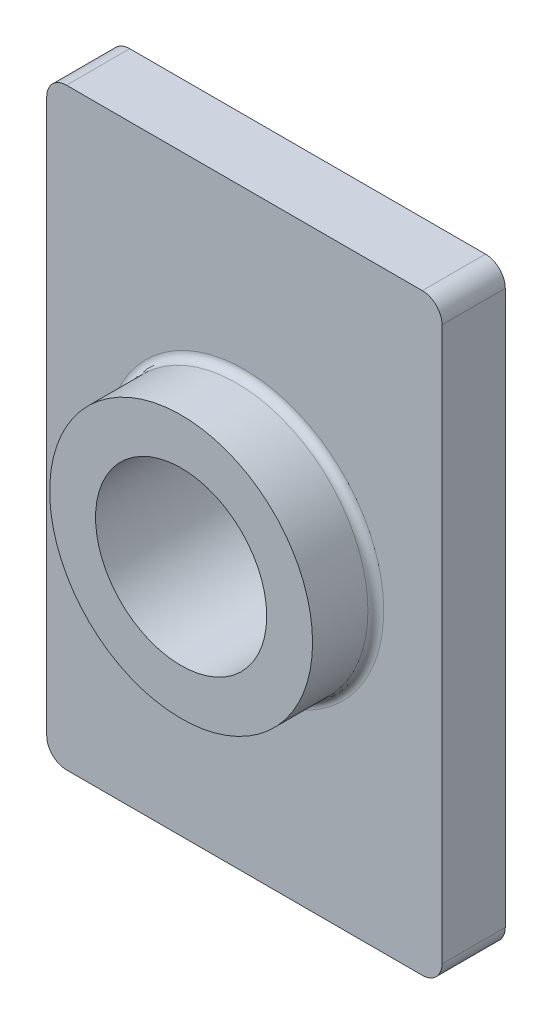
ISO-10303-21;
HEADER;
FILE_DESCRIPTION(('STEP AP214'),'2;1');
FILE_NAME('part.step','',(''),(''),'','','');
FILE_SCHEMA(('AUTOMOTIVE_DESIGN { 1 0 10303 214 1 1 1 1 }'));
ENDSEC;
DATA;
#1=APPLICATION_CONTEXT('core data for automotive mechanical design processes');
#2=APPLICATION_PROTOCOL_DEFINITION('international standard','automotive_design',2000,#1);
#3=PRODUCT_CONTEXT('',#1,'mechanical');
#4=PRODUCT('Part','Part','',(#3));
#5=PRODUCT_RELATED_PRODUCT_CATEGORY('part','',(#4));
#6=PRODUCT_DEFINITION_FORMATION('','',#4);
#7=PRODUCT_DEFINITION_CONTEXT('part definition',#1,'design');
#8=PRODUCT_DEFINITION('design','',#6,#7);
#9=PRODUCT_DEFINITION_SHAPE('','',#8);
#10=(LENGTH_UNIT() NAMED_UNIT(*) SI_UNIT(.MILLI.,.METRE.));
#11=(NAMED_UNIT(*) PLANE_ANGLE_UNIT() SI_UNIT($,.RADIAN.));
#12=(NAMED_UNIT(*) SI_UNIT($,.STERADIAN.) SOLID_ANGLE_UNIT());
#13=UNCERTAINTY_MEASURE_WITH_UNIT(LENGTH_MEASURE(1.E-05),#10,'distance_accuracy_value','');
#14=(GEOMETRIC_REPRESENTATION_CONTEXT(3) GLOBAL_UNCERTAINTY_ASSIGNED_CONTEXT((#13)) GLOBAL_UNIT_ASSIGNED_CONTEXT((#10,
#11,#12)) REPRESENTATION_CONTEXT('',''));
#15=CARTESIAN_POINT('',(0.,0.,0.));
#16=DIRECTION('',(0.,0.,1.));
#17=DIRECTION('',(1.,0.,0.));
#18=AXIS2_PLACEMENT_3D('',#15,#16,#17);
#19=CARTESIAN_POINT('',(5.,7.5,1.8));
#20=DIRECTION('',(0.,0.,-1.));
#21=DIRECTION('',(1.,0.,0.));
#22=AXIS2_PLACEMENT_3D('',#19,#20,#21);
#23=TOROIDAL_SURFACE('',#22,3.525,0.2);
#24=CARTESIAN_POINT('',(5.,7.5,1.6));
#25=DIRECTION('',(0.,0.,1.));
#26=DIRECTION('',(1.,0.,0.));
#27=AXIS2_PLACEMENT_3D('',#24,#25,#26);
#28=CIRCLE('',#27,3.525);
#29=CARTESIAN_POINT('',(8.525,7.5,1.6));
#30=VERTEX_POINT('',#29);
#31=EDGE_CURVE('E120',#30,#30,#28,.F.);
#32=ORIENTED_EDGE('',*,*,#31,.F.);
#33=EDGE_LOOP('',(#32));
#34=FACE_BOUND('',#33,.T.);
#35=CARTESIAN_POINT('',(5.,7.5,1.8));
#36=DIRECTION('',(0.,0.,1.));
#37=DIRECTION('',(1.,0.,0.));
#38=AXIS2_PLACEMENT_3D('',#35,#36,#37);
#39=CIRCLE('',#38,3.325);
#40=CARTESIAN_POINT('',(8.325,7.5,1.8));
#41=VERTEX_POINT('',#40);
#42=EDGE_CURVE('E70',#41,#41,#39,.T.);
#43=ORIENTED_EDGE('',*,*,#42,.F.);
#44=EDGE_LOOP('',(#43));
#45=FACE_BOUND('',#44,.T.);
#46=ADVANCED_FACE('F17',(#34,#45),#23,.F.);
#47=CARTESIAN_POINT('',(5.,7.5,1.6));
#48=DIRECTION('',(0.,0.,1.));
#49=DIRECTION('',(1.,0.,0.));
#50=AXIS2_PLACEMENT_3D('',#47,#48,#49);
#51=CYLINDRICAL_SURFACE('',#50,3.325);
#52=ORIENTED_EDGE('',*,*,#42,.T.);
#53=EDGE_LOOP('',(#52));
#54=FACE_BOUND('',#53,.T.);
#55=CARTESIAN_POINT('',(5.,7.5,3.2));
#56=DIRECTION('',(0.,0.,1.));
#57=DIRECTION('',(1.,0.,0.));
#58=AXIS2_PLACEMENT_3D('',#55,#56,#57);
#59=CIRCLE('',#58,3.325);
#60=CARTESIAN_POINT('',(8.325,7.5,3.2));
#61=VERTEX_POINT('',#60);
#62=EDGE_CURVE('E112',#61,#61,#59,.T.);
#63=ORIENTED_EDGE('',*,*,#62,.F.);
#64=EDGE_LOOP('',(#63));
#65=FACE_BOUND('',#64,.T.);
#66=ADVANCED_FACE('F147',(#54,#65),#51,.T.);
#67=CARTESIAN_POINT('',(9.5,0.500000000000001,0.));
#68=DIRECTION('',(0.,0.,1.));
#69=DIRECTION('',(1.,0.,0.));
#70=AXIS2_PLACEMENT_3D('',#67,#68,#69);
#71=CYLINDRICAL_SURFACE('',#70,0.5);
#72=CARTESIAN_POINT('',(9.5,0.500000000000001,0.));
#73=DIRECTION('',(0.,0.,1.));
#74=DIRECTION('',(1.,0.,0.));
#75=AXIS2_PLACEMENT_3D('',#72,#73,#74);
#76=CIRCLE('',#75,0.5);
#77=CARTESIAN_POINT('',(9.5,0.,0.));
#78=VERTEX_POINT('',#77);
#79=CARTESIAN_POINT('',(10.,0.500000000000001,0.));
#80=VERTEX_POINT('',#79);
#81=EDGE_CURVE('E22',#78,#80,#76,.T.);
#82=ORIENTED_EDGE('',*,*,#81,.T.);
#83=DIRECTION('',(0.,0.,1.));
#84=VECTOR('',#83,1.);
#85=CARTESIAN_POINT('',(10.,0.5,0.));
#86=LINE('',#85,#84);
#87=CARTESIAN_POINT('',(10.,0.500000000000001,1.6));
#88=VERTEX_POINT('',#87);
#89=EDGE_CURVE('E65',#88,#80,#86,.F.);
#90=ORIENTED_EDGE('',*,*,#89,.F.);
#91=CARTESIAN_POINT('',(9.5,0.500000000000001,1.6));
#92=DIRECTION('',(0.,0.,1.));
#93=DIRECTION('',(1.,0.,0.));
#94=AXIS2_PLACEMENT_3D('',#91,#92,#93);
#95=CIRCLE('',#94,0.5);
#96=CARTESIAN_POINT('',(9.5,0.,1.6));
#97=VERTEX_POINT('',#96);
#98=EDGE_CURVE('E205',#97,#88,#95,.T.);
#99=ORIENTED_EDGE('',*,*,#98,.F.);
#100=DIRECTION('',(0.,0.,-1.));
#101=VECTOR('',#100,1.);
#102=CARTESIAN_POINT('',(9.5,0.,0.));
#103=LINE('',#102,#101);
#104=EDGE_CURVE('E67',#78,#97,#103,.F.);
#105=ORIENTED_EDGE('',*,*,#104,.F.);
#106=EDGE_LOOP('',(#82,#90,#99,#105));
#107=FACE_BOUND('',#106,.T.);
#108=ADVANCED_FACE('F62',(#107),#71,.T.);
#109=CARTESIAN_POINT('',(9.5,14.5,0.));
#110=DIRECTION('',(0.,0.,1.));
#111=DIRECTION('',(1.,0.,0.));
#112=AXIS2_PLACEMENT_3D('',#109,#110,#111);
#113=CYLINDRICAL_SURFACE('',#112,0.5);
#114=CARTESIAN_POINT('',(9.5,14.5,0.));
#115=DIRECTION('',(0.,0.,1.));
#116=DIRECTION('',(1.,0.,0.));
#117=AXIS2_PLACEMENT_3D('',#114,#115,#116);
#118=CIRCLE('',#117,0.5);
#119=CARTESIAN_POINT('',(10.,14.5,0.));
#120=VERTEX_POINT('',#119);
#121=CARTESIAN_POINT('',(9.5,15.,0.));
#122=VERTEX_POINT('',#121);
#123=EDGE_CURVE('E69',#120,#122,#118,.T.);
#124=ORIENTED_EDGE('',*,*,#123,.T.);
#125=DIRECTION('',(0.,0.,1.));
#126=VECTOR('',#125,1.);
#127=CARTESIAN_POINT('',(9.5,15.,0.));
#128=LINE('',#127,#126);
#129=CARTESIAN_POINT('',(9.5,15.,1.6));
#130=VERTEX_POINT('',#129);
#131=EDGE_CURVE('E102',#130,#122,#128,.F.);
#132=ORIENTED_EDGE('',*,*,#131,.F.);
#133=CARTESIAN_POINT('',(9.5,14.5,1.6));
#134=DIRECTION('',(0.,0.,1.));
#135=DIRECTION('',(1.,0.,0.));
#136=AXIS2_PLACEMENT_3D('',#133,#134,#135);
#137=CIRCLE('',#136,0.5);
#138=CARTESIAN_POINT('',(10.,14.5,1.6));
#139=VERTEX_POINT('',#138);
#140=EDGE_CURVE('E202',#139,#130,#137,.T.);
#141=ORIENTED_EDGE('',*,*,#140,.F.);
#142=DIRECTION('',(0.,0.,1.));
#143=VECTOR('',#142,1.);
#144=CARTESIAN_POINT('',(10.,14.5,0.));
#145=LINE('',#144,#143);
#146=EDGE_CURVE('E79',#120,#139,#145,.T.);
#147=ORIENTED_EDGE('',*,*,#146,.F.);
#148=EDGE_LOOP('',(#124,#132,#141,#147));
#149=FACE_BOUND('',#148,.T.);
#150=ADVANCED_FACE('F141',(#149),#113,.T.);
#151=CARTESIAN_POINT('',(0.5,0.500000000000001,0.));
#152=DIRECTION('',(0.,0.,1.));
#153=DIRECTION('',(1.,0.,0.));
#154=AXIS2_PLACEMENT_3D('',#151,#152,#153);
#155=CYLINDRICAL_SURFACE('',#154,0.5);
#156=CARTESIAN_POINT('',(0.5,0.500000000000001,0.));
#157=DIRECTION('',(0.,0.,1.));
#158=DIRECTION('',(1.,0.,0.));
#159=AXIS2_PLACEMENT_3D('',#156,#157,#158);
#160=CIRCLE('',#159,0.5);
#161=CARTESIAN_POINT('',(0.,0.500000000000001,0.));
#162=VERTEX_POINT('',#161);
#163=CARTESIAN_POINT('',(0.499999999999999,0.,0.));
#164=VERTEX_POINT('',#163);
#165=EDGE_CURVE('E37',#162,#164,#160,.T.);
#166=ORIENTED_EDGE('',*,*,#165,.T.);
#167=DIRECTION('',(0.,0.,-1.));
#168=VECTOR('',#167,1.);
#169=CARTESIAN_POINT('',(0.499999999999999,0.,0.));
#170=LINE('',#169,#168);
#171=CARTESIAN_POINT('',(0.499999999999999,0.,1.6));
#172=VERTEX_POINT('',#171);
#173=EDGE_CURVE('E109',#172,#164,#170,.T.);
#174=ORIENTED_EDGE('',*,*,#173,.F.);
#175=CARTESIAN_POINT('',(0.5,0.500000000000001,1.6));
#176=DIRECTION('',(0.,0.,1.));
#177=DIRECTION('',(1.,0.,0.));
#178=AXIS2_PLACEMENT_3D('',#175,#176,#177);
#179=CIRCLE('',#178,0.5);
#180=CARTESIAN_POINT('',(0.,0.500000000000001,1.6));
#181=VERTEX_POINT('',#180);
#182=EDGE_CURVE('E208',#181,#172,#179,.T.);
#183=ORIENTED_EDGE('',*,*,#182,.F.);
#184=DIRECTION('',(0.,0.,1.));
#185=VECTOR('',#184,1.);
#186=CARTESIAN_POINT('',(0.,0.500000000000001,0.));
#187=LINE('',#186,#185);
#188=EDGE_CURVE('E98',#162,#181,#187,.T.);
#189=ORIENTED_EDGE('',*,*,#188,.F.);
#190=EDGE_LOOP('',(#166,#174,#183,#189));
#191=FACE_BOUND('',#190,.T.);
#192=ADVANCED_FACE('F137',(#191),#155,.T.);
#193=CARTESIAN_POINT('',(5.,7.5,1.6));
#194=DIRECTION('',(0.,0.,1.));
#195=DIRECTION('',(1.,0.,0.));
#196=AXIS2_PLACEMENT_3D('',#193,#194,#195);
#197=PLANE('',#196);
#198=ORIENTED_EDGE('',*,*,#31,.T.);
#199=EDGE_LOOP('',(#198));
#200=FACE_BOUND('',#199,.T.);
#201=CARTESIAN_POINT('',(0.499999999999999,14.5,1.6));
#202=DIRECTION('',(0.,0.,1.));
#203=DIRECTION('',(1.,0.,0.));
#204=AXIS2_PLACEMENT_3D('',#201,#202,#203);
#205=CIRCLE('',#204,0.5);
#206=CARTESIAN_POINT('',(0.,14.5,1.6));
#207=VERTEX_POINT('',#206);
#208=CARTESIAN_POINT('',(0.499999999999999,15.,1.6));
#209=VERTEX_POINT('',#208);
#210=EDGE_CURVE('E199',#207,#209,#205,.F.);
#211=ORIENTED_EDGE('',*,*,#210,.F.);
#212=DIRECTION('',(0.,-1.,0.));
#213=VECTOR('',#212,1.);
#214=CARTESIAN_POINT('',(0.,7.5,1.6));
#215=LINE('',#214,#213);
#216=EDGE_CURVE('E97',#181,#207,#215,.F.);
#217=ORIENTED_EDGE('',*,*,#216,.F.);
#218=ORIENTED_EDGE('',*,*,#182,.T.);
#219=DIRECTION('',(1.,0.,0.));
#220=VECTOR('',#219,1.);
#221=CARTESIAN_POINT('',(5.,0.,1.6));
#222=LINE('',#221,#220);
#223=EDGE_CURVE('E80',#97,#172,#222,.F.);
#224=ORIENTED_EDGE('',*,*,#223,.F.);
#225=ORIENTED_EDGE('',*,*,#98,.T.);
#226=DIRECTION('',(0.,1.,0.));
#227=VECTOR('',#226,1.);
#228=CARTESIAN_POINT('',(10.,7.5,1.6));
#229=LINE('',#228,#227);
#230=EDGE_CURVE('E78',#139,#88,#229,.F.);
#231=ORIENTED_EDGE('',*,*,#230,.F.);
#232=ORIENTED_EDGE('',*,*,#140,.T.);
#233=DIRECTION('',(1.,0.,0.));
#234=VECTOR('',#233,1.);
#235=CARTESIAN_POINT('',(5.,15.,1.6));
#236=LINE('',#235,#234);
#237=EDGE_CURVE('E101',#209,#130,#236,.T.);
#238=ORIENTED_EDGE('',*,*,#237,.F.);
#239=EDGE_LOOP('',(#211,#217,#218,#224,#225,#231,#232,#238));
#240=FACE_BOUND('',#239,.T.);
#241=ADVANCED_FACE('F126',(#200,#240),#197,.T.);
#242=CARTESIAN_POINT('',(0.499999999999999,14.5,0.));
#243=DIRECTION('',(0.,0.,1.));
#244=DIRECTION('',(1.,0.,0.));
#245=AXIS2_PLACEMENT_3D('',#242,#243,#244);
#246=CYLINDRICAL_SURFACE('',#245,0.5);
#247=CARTESIAN_POINT('',(0.499999999999999,14.5,0.));
#248=DIRECTION('',(0.,0.,1.));
#249=DIRECTION('',(1.,0.,0.));
#250=AXIS2_PLACEMENT_3D('',#247,#248,#249);
#251=CIRCLE('',#250,0.5);
#252=CARTESIAN_POINT('',(0.499999999999999,15.,0.));
#253=VERTEX_POINT('',#252);
#254=CARTESIAN_POINT('',(0.,14.5,0.));
#255=VERTEX_POINT('',#254);
#256=EDGE_CURVE('E197',#253,#255,#251,.T.);
#257=ORIENTED_EDGE('',*,*,#256,.T.);
#258=DIRECTION('',(0.,0.,1.));
#259=VECTOR('',#258,1.);
#260=CARTESIAN_POINT('',(0.,14.5,0.));
#261=LINE('',#260,#259);
#262=EDGE_CURVE('E94',#207,#255,#261,.F.);
#263=ORIENTED_EDGE('',*,*,#262,.F.);
#264=ORIENTED_EDGE('',*,*,#210,.T.);
#265=DIRECTION('',(0.,0.,1.));
#266=VECTOR('',#265,1.);
#267=CARTESIAN_POINT('',(0.499999999999999,15.,0.));
#268=LINE('',#267,#266);
#269=EDGE_CURVE('E105',#253,#209,#268,.T.);
#270=ORIENTED_EDGE('',*,*,#269,.F.);
#271=EDGE_LOOP('',(#257,#263,#264,#270));
#272=FACE_BOUND('',#271,.T.);
#273=ADVANCED_FACE('F136',(#272),#246,.T.);
#274=CARTESIAN_POINT('',(5.,7.5,3.2));
#275=DIRECTION('',(0.,0.,1.));
#276=DIRECTION('',(1.,0.,0.));
#277=AXIS2_PLACEMENT_3D('',#274,#275,#276);
#278=PLANE('',#277);
#279=ORIENTED_EDGE('',*,*,#62,.T.);
#280=EDGE_LOOP('',(#279));
#281=FACE_BOUND('',#280,.T.);
#282=CARTESIAN_POINT('',(5.,7.5,3.2));
#283=DIRECTION('',(0.,0.,1.));
#284=DIRECTION('',(1.,0.,0.));
#285=AXIS2_PLACEMENT_3D('',#282,#283,#284);
#286=CIRCLE('',#285,2.165);
#287=CARTESIAN_POINT('',(7.165,7.5,3.2));
#288=VERTEX_POINT('',#287);
#289=EDGE_CURVE('E90',#288,#288,#286,.F.);
#290=ORIENTED_EDGE('',*,*,#289,.T.);
#291=EDGE_LOOP('',(#290));
#292=FACE_BOUND('',#291,.T.);
#293=ADVANCED_FACE('F180',(#281,#292),#278,.T.);
#294=CARTESIAN_POINT('',(5.,0.,0.));
#295=DIRECTION('',(0.,-1.,0.));
#296=DIRECTION('',(0.,0.,-1.));
#297=AXIS2_PLACEMENT_3D('',#294,#295,#296);
#298=PLANE('',#297);
#299=ORIENTED_EDGE('',*,*,#104,.T.);
#300=ORIENTED_EDGE('',*,*,#223,.T.);
#301=ORIENTED_EDGE('',*,*,#173,.T.);
#302=DIRECTION('',(1.,0.,0.));
#303=VECTOR('',#302,1.);
#304=CARTESIAN_POINT('',(5.,0.,0.));
#305=LINE('',#304,#303);
#306=EDGE_CURVE('E86',#164,#78,#305,.T.);
#307=ORIENTED_EDGE('',*,*,#306,.T.);
#308=EDGE_LOOP('',(#299,#300,#301,#307));
#309=FACE_BOUND('',#308,.T.);
#310=ADVANCED_FACE('F178',(#309),#298,.T.);
#311=CARTESIAN_POINT('',(10.,7.5,0.));
#312=DIRECTION('',(1.,0.,0.));
#313=DIRECTION('',(0.,1.,0.));
#314=AXIS2_PLACEMENT_3D('',#311,#312,#313);
#315=PLANE('',#314);
#316=ORIENTED_EDGE('',*,*,#146,.T.);
#317=ORIENTED_EDGE('',*,*,#230,.T.);
#318=ORIENTED_EDGE('',*,*,#89,.T.);
#319=DIRECTION('',(0.,1.,0.));
#320=VECTOR('',#319,1.);
#321=CARTESIAN_POINT('',(10.,7.5,0.));
#322=LINE('',#321,#320);
#323=EDGE_CURVE('E76',#80,#120,#322,.T.);
#324=ORIENTED_EDGE('',*,*,#323,.T.);
#325=EDGE_LOOP('',(#316,#317,#318,#324));
#326=FACE_BOUND('',#325,.T.);
#327=ADVANCED_FACE('F75',(#326),#315,.T.);
#328=CARTESIAN_POINT('',(5.,15.,0.));
#329=DIRECTION('',(0.,1.,0.));
#330=DIRECTION('',(0.,0.,1.));
#331=AXIS2_PLACEMENT_3D('',#328,#329,#330);
#332=PLANE('',#331);
#333=ORIENTED_EDGE('',*,*,#269,.T.);
#334=ORIENTED_EDGE('',*,*,#237,.T.);
#335=ORIENTED_EDGE('',*,*,#131,.T.);
#336=DIRECTION('',(1.,0.,0.));
#337=VECTOR('',#336,1.);
#338=CARTESIAN_POINT('',(5.,15.,0.));
#339=LINE('',#338,#337);
#340=EDGE_CURVE('E85',#122,#253,#339,.F.);
#341=ORIENTED_EDGE('',*,*,#340,.T.);
#342=EDGE_LOOP('',(#333,#334,#335,#341));
#343=FACE_BOUND('',#342,.T.);
#344=ADVANCED_FACE('F171',(#343),#332,.T.);
#345=CARTESIAN_POINT('',(0.,7.5,0.));
#346=DIRECTION('',(-1.,0.,0.));
#347=DIRECTION('',(0.,-1.,0.));
#348=AXIS2_PLACEMENT_3D('',#345,#346,#347);
#349=PLANE('',#348);
#350=ORIENTED_EDGE('',*,*,#262,.T.);
#351=DIRECTION('',(0.,1.,0.));
#352=VECTOR('',#351,1.);
#353=CARTESIAN_POINT('',(0.,7.5,0.));
#354=LINE('',#353,#352);
#355=EDGE_CURVE('E28',#255,#162,#354,.F.);
#356=ORIENTED_EDGE('',*,*,#355,.T.);
#357=ORIENTED_EDGE('',*,*,#188,.T.);
#358=ORIENTED_EDGE('',*,*,#216,.T.);
#359=EDGE_LOOP('',(#350,#356,#357,#358));
#360=FACE_BOUND('',#359,.T.);
#361=ADVANCED_FACE('F164',(#360),#349,.T.);
#362=CARTESIAN_POINT('',(5.,7.5,-15.1095603442573));
#363=DIRECTION('',(0.,0.,1.));
#364=DIRECTION('',(1.,0.,0.));
#365=AXIS2_PLACEMENT_3D('',#362,#363,#364);
#366=CYLINDRICAL_SURFACE('',#365,2.165);
#367=ORIENTED_EDGE('',*,*,#289,.F.);
#368=EDGE_LOOP('',(#367));
#369=FACE_BOUND('',#368,.T.);
#370=CARTESIAN_POINT('',(5.,7.5,0.));
#371=DIRECTION('',(0.,0.,1.));
#372=DIRECTION('',(1.,0.,0.));
#373=AXIS2_PLACEMENT_3D('',#370,#371,#372);
#374=CIRCLE('',#373,2.165);
#375=CARTESIAN_POINT('',(7.165,7.5,0.));
#376=VERTEX_POINT('',#375);
#377=EDGE_CURVE('E11',#376,#376,#374,.F.);
#378=ORIENTED_EDGE('',*,*,#377,.T.);
#379=EDGE_LOOP('',(#378));
#380=FACE_BOUND('',#379,.T.);
#381=ADVANCED_FACE('F158',(#369,#380),#366,.F.);
#382=CARTESIAN_POINT('',(5.,7.5,0.));
#383=DIRECTION('',(0.,0.,1.));
#384=DIRECTION('',(1.,0.,0.));
#385=AXIS2_PLACEMENT_3D('',#382,#383,#384);
#386=PLANE('',#385);
#387=ORIENTED_EDGE('',*,*,#377,.F.);
#388=EDGE_LOOP('',(#387));
#389=FACE_BOUND('',#388,.T.);
#390=ORIENTED_EDGE('',*,*,#355,.F.);
#391=ORIENTED_EDGE('',*,*,#256,.F.);
#392=ORIENTED_EDGE('',*,*,#340,.F.);
#393=ORIENTED_EDGE('',*,*,#123,.F.);
#394=ORIENTED_EDGE('',*,*,#323,.F.);
#395=ORIENTED_EDGE('',*,*,#81,.F.);
#396=ORIENTED_EDGE('',*,*,#306,.F.);
#397=ORIENTED_EDGE('',*,*,#165,.F.);
#398=EDGE_LOOP('',(#390,#391,#392,#393,#394,#395,#396,#397));
#399=FACE_BOUND('',#398,.T.);
#400=ADVANCED_FACE('F82',(#389,#399),#386,.F.);
#401=CLOSED_SHELL('',(#46,#66,#108,#150,#192,#241,#273,#293,#310,#327,#344,#361,#381,#400));
#402=MANIFOLD_SOLID_BREP('B1',#401);
#403=ADVANCED_BREP_SHAPE_REPRESENTATION('',(#18,#402),#14);
#404=SHAPE_DEFINITION_REPRESENTATION(#9,#403);
ENDSEC;
END-ISO-10303-21;
